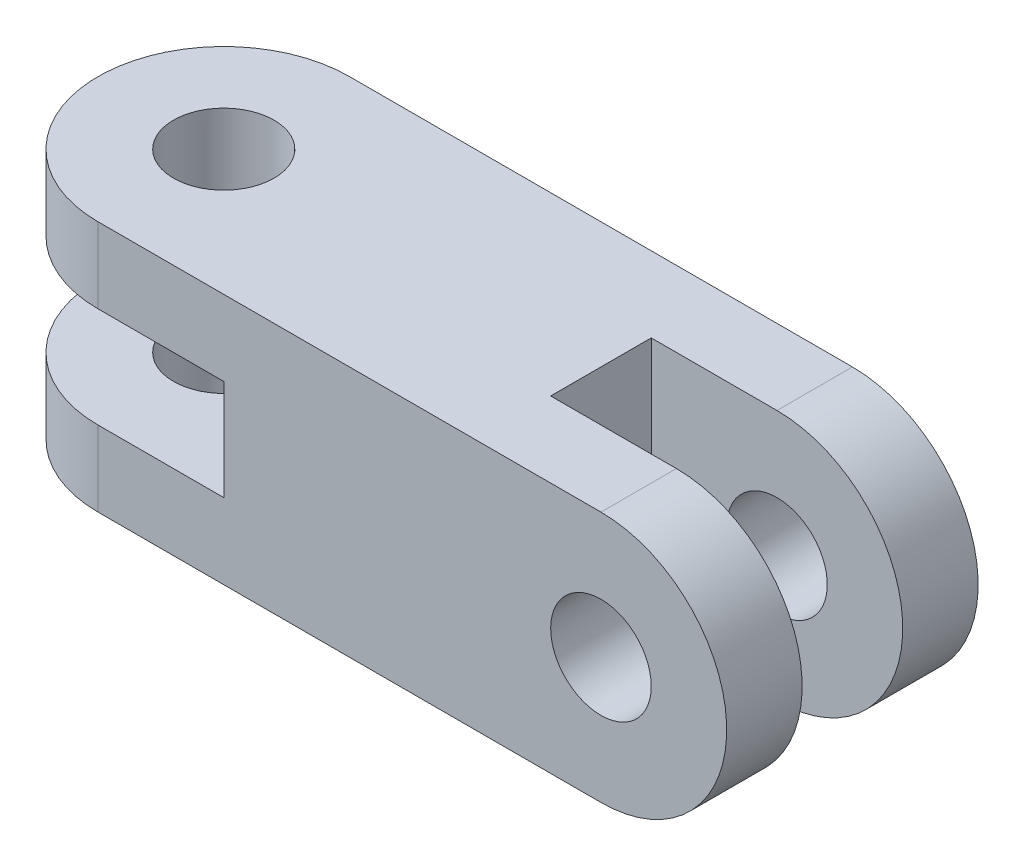
ISO-10303-21;
HEADER;
FILE_DESCRIPTION(('STEP AP214'),'2;1');
FILE_NAME('part.step','',(''),(''),'','','');
FILE_SCHEMA(('AUTOMOTIVE_DESIGN { 1 0 10303 214 1 1 1 1 }'));
ENDSEC;
DATA;
#1=APPLICATION_CONTEXT('core data for automotive mechanical design processes');
#2=APPLICATION_PROTOCOL_DEFINITION('international standard','automotive_design',2000,#1);
#3=PRODUCT_CONTEXT('',#1,'mechanical');
#4=PRODUCT('Part','Part','',(#3));
#5=PRODUCT_RELATED_PRODUCT_CATEGORY('part','',(#4));
#6=PRODUCT_DEFINITION_FORMATION('','',#4);
#7=PRODUCT_DEFINITION_CONTEXT('part definition',#1,'design');
#8=PRODUCT_DEFINITION('design','',#6,#7);
#9=PRODUCT_DEFINITION_SHAPE('','',#8);
#10=(LENGTH_UNIT() NAMED_UNIT(*) SI_UNIT(.MILLI.,.METRE.));
#11=(NAMED_UNIT(*) PLANE_ANGLE_UNIT() SI_UNIT($,.RADIAN.));
#12=(NAMED_UNIT(*) SI_UNIT($,.STERADIAN.) SOLID_ANGLE_UNIT());
#13=UNCERTAINTY_MEASURE_WITH_UNIT(LENGTH_MEASURE(1.E-05),#10,'distance_accuracy_value','');
#14=(GEOMETRIC_REPRESENTATION_CONTEXT(3) GLOBAL_UNCERTAINTY_ASSIGNED_CONTEXT((#13)) GLOBAL_UNIT_ASSIGNED_CONTEXT((#10,
#11,#12)) REPRESENTATION_CONTEXT('',''));
#15=CARTESIAN_POINT('',(0.,0.,0.));
#16=DIRECTION('',(0.,0.,1.));
#17=DIRECTION('',(1.,0.,0.));
#18=AXIS2_PLACEMENT_3D('',#15,#16,#17);
#19=CARTESIAN_POINT('',(0.,25.,50.));
#20=DIRECTION('',(0.,-1.,0.));
#21=DIRECTION('',(1.,0.,0.));
#22=AXIS2_PLACEMENT_3D('',#19,#20,#21);
#23=PLANE('',#22);
#24=CARTESIAN_POINT('',(-100.,25.,25.));
#25=DIRECTION('',(0.,-1.,0.));
#26=DIRECTION('',(1.,0.,0.));
#27=AXIS2_PLACEMENT_3D('',#24,#25,#26);
#28=CIRCLE('',#27,9.99999999999999);
#29=CARTESIAN_POINT('',(-90.,25.,25.));
#30=VERTEX_POINT('',#29);
#31=EDGE_CURVE('E319',#30,#30,#28,.T.);
#32=ORIENTED_EDGE('',*,*,#31,.T.);
#33=EDGE_LOOP('',(#32));
#34=FACE_BOUND('',#33,.T.);
#35=DIRECTION('',(0.,0.,1.));
#36=VECTOR('',#35,1.);
#37=CARTESIAN_POINT('',(-25.,25.,0.));
#38=LINE('',#37,#36);
#39=CARTESIAN_POINT('',(-25.,25.,15.));
#40=VERTEX_POINT('',#39);
#41=CARTESIAN_POINT('',(-25.,25.,35.));
#42=VERTEX_POINT('',#41);
#43=EDGE_CURVE('E334',#40,#42,#38,.T.);
#44=ORIENTED_EDGE('',*,*,#43,.F.);
#45=DIRECTION('',(1.,0.,0.));
#46=VECTOR('',#45,1.);
#47=CARTESIAN_POINT('',(0.,25.,15.));
#48=LINE('',#47,#46);
#49=CARTESIAN_POINT('',(0.,25.,15.));
#50=VERTEX_POINT('',#49);
#51=EDGE_CURVE('E329',#40,#50,#48,.T.);
#52=ORIENTED_EDGE('',*,*,#51,.T.);
#53=DIRECTION('',(0.,0.,-1.));
#54=VECTOR('',#53,1.);
#55=CARTESIAN_POINT('',(0.,25.,50.));
#56=LINE('',#55,#54);
#57=CARTESIAN_POINT('',(0.,25.,0.));
#58=VERTEX_POINT('',#57);
#59=EDGE_CURVE('E183',#50,#58,#56,.T.);
#60=ORIENTED_EDGE('',*,*,#59,.T.);
#61=DIRECTION('',(-1.,0.,0.));
#62=VECTOR('',#61,1.);
#63=CARTESIAN_POINT('',(0.,25.,0.));
#64=LINE('',#63,#62);
#65=CARTESIAN_POINT('',(-100.,25.,0.));
#66=VERTEX_POINT('',#65);
#67=EDGE_CURVE('E174',#58,#66,#64,.T.);
#68=ORIENTED_EDGE('',*,*,#67,.T.);
#69=CARTESIAN_POINT('',(-100.,25.,25.));
#70=DIRECTION('',(0.,-1.,0.));
#71=DIRECTION('',(1.,0.,0.));
#72=AXIS2_PLACEMENT_3D('',#69,#70,#71);
#73=CIRCLE('',#72,25.);
#74=CARTESIAN_POINT('',(-100.,25.,50.));
#75=VERTEX_POINT('',#74);
#76=EDGE_CURVE('E159',#75,#66,#73,.T.);
#77=ORIENTED_EDGE('',*,*,#76,.F.);
#78=DIRECTION('',(-1.,0.,0.));
#79=VECTOR('',#78,1.);
#80=CARTESIAN_POINT('',(0.,25.,50.));
#81=LINE('',#80,#79);
#82=CARTESIAN_POINT('',(0.,25.,50.));
#83=VERTEX_POINT('',#82);
#84=EDGE_CURVE('E109',#83,#75,#81,.T.);
#85=ORIENTED_EDGE('',*,*,#84,.F.);
#86=CARTESIAN_POINT('',(0.,25.,35.));
#87=VERTEX_POINT('',#86);
#88=EDGE_CURVE('E66',#83,#87,#56,.T.);
#89=ORIENTED_EDGE('',*,*,#88,.T.);
#90=DIRECTION('',(1.,0.,0.));
#91=VECTOR('',#90,1.);
#92=CARTESIAN_POINT('',(0.,25.,35.));
#93=LINE('',#92,#91);
#94=EDGE_CURVE('E331',#42,#87,#93,.T.);
#95=ORIENTED_EDGE('',*,*,#94,.F.);
#96=EDGE_LOOP('',(#44,#52,#60,#68,#77,#85,#89,#95));
#97=FACE_BOUND('',#96,.T.);
#98=ADVANCED_FACE('F57',(#34,#97),#23,.F.);
#99=CARTESIAN_POINT('',(-125.,9.99999999999999,50.));
#100=DIRECTION('',(0.,1.,0.));
#101=DIRECTION('',(0.,0.,1.));
#102=AXIS2_PLACEMENT_3D('',#99,#100,#101);
#103=PLANE('',#102);
#104=CARTESIAN_POINT('',(-100.,9.99999999999999,25.));
#105=DIRECTION('',(0.,1.,0.));
#106=DIRECTION('',(0.,0.,1.));
#107=AXIS2_PLACEMENT_3D('',#104,#105,#106);
#108=CIRCLE('',#107,9.99999999999999);
#109=CARTESIAN_POINT('',(-100.,9.99999999999999,35.));
#110=VERTEX_POINT('',#109);
#111=EDGE_CURVE('E226',#110,#110,#108,.T.);
#112=ORIENTED_EDGE('',*,*,#111,.T.);
#113=EDGE_LOOP('',(#112));
#114=FACE_BOUND('',#113,.T.);
#115=CARTESIAN_POINT('',(-100.,9.99999999999999,25.));
#116=DIRECTION('',(0.,1.,0.));
#117=DIRECTION('',(0.,0.,1.));
#118=AXIS2_PLACEMENT_3D('',#115,#116,#117);
#119=CIRCLE('',#118,25.);
#120=CARTESIAN_POINT('',(-100.,9.99999999999999,0.));
#121=VERTEX_POINT('',#120);
#122=CARTESIAN_POINT('',(-100.,9.99999999999999,50.));
#123=VERTEX_POINT('',#122);
#124=EDGE_CURVE('E233',#121,#123,#119,.T.);
#125=ORIENTED_EDGE('',*,*,#124,.F.);
#126=DIRECTION('',(1.,0.,0.));
#127=VECTOR('',#126,1.);
#128=CARTESIAN_POINT('',(-125.,9.99999999999999,0.));
#129=LINE('',#128,#127);
#130=CARTESIAN_POINT('',(-75.,9.99999999999999,0.));
#131=VERTEX_POINT('',#130);
#132=EDGE_CURVE('E176',#121,#131,#129,.T.);
#133=ORIENTED_EDGE('',*,*,#132,.T.);
#134=DIRECTION('',(0.,0.,-1.));
#135=VECTOR('',#134,1.);
#136=CARTESIAN_POINT('',(-75.,9.99999999999999,50.));
#137=LINE('',#136,#135);
#138=CARTESIAN_POINT('',(-75.,9.99999999999999,50.));
#139=VERTEX_POINT('',#138);
#140=EDGE_CURVE('E203',#139,#131,#137,.T.);
#141=ORIENTED_EDGE('',*,*,#140,.F.);
#142=DIRECTION('',(1.,0.,0.));
#143=VECTOR('',#142,1.);
#144=CARTESIAN_POINT('',(-125.,9.99999999999999,50.));
#145=LINE('',#144,#143);
#146=EDGE_CURVE('E242',#123,#139,#145,.T.);
#147=ORIENTED_EDGE('',*,*,#146,.F.);
#148=EDGE_LOOP('',(#125,#133,#141,#147));
#149=FACE_BOUND('',#148,.T.);
#150=ADVANCED_FACE('F264',(#114,#149),#103,.F.);
#151=CARTESIAN_POINT('',(-125.,-9.99999999999999,50.));
#152=DIRECTION('',(0.,-1.,0.));
#153=DIRECTION('',(0.,0.,-1.));
#154=AXIS2_PLACEMENT_3D('',#151,#152,#153);
#155=PLANE('',#154);
#156=CARTESIAN_POINT('',(-100.,-9.99999999999999,25.));
#157=DIRECTION('',(0.,-1.,0.));
#158=DIRECTION('',(0.,0.,-1.));
#159=AXIS2_PLACEMENT_3D('',#156,#157,#158);
#160=CIRCLE('',#159,9.99999999999999);
#161=CARTESIAN_POINT('',(-100.,-9.99999999999999,15.));
#162=VERTEX_POINT('',#161);
#163=EDGE_CURVE('E213',#162,#162,#160,.T.);
#164=ORIENTED_EDGE('',*,*,#163,.T.);
#165=EDGE_LOOP('',(#164));
#166=FACE_BOUND('',#165,.T.);
#167=DIRECTION('',(-1.,0.,0.));
#168=VECTOR('',#167,1.);
#169=CARTESIAN_POINT('',(-125.,-9.99999999999999,0.));
#170=LINE('',#169,#168);
#171=CARTESIAN_POINT('',(-75.,-9.99999999999999,0.));
#172=VERTEX_POINT('',#171);
#173=CARTESIAN_POINT('',(-100.,-9.99999999999999,0.));
#174=VERTEX_POINT('',#173);
#175=EDGE_CURVE('E192',#172,#174,#170,.T.);
#176=ORIENTED_EDGE('',*,*,#175,.T.);
#177=CARTESIAN_POINT('',(-100.,-9.99999999999999,25.));
#178=DIRECTION('',(0.,-1.,0.));
#179=DIRECTION('',(0.,0.,-1.));
#180=AXIS2_PLACEMENT_3D('',#177,#178,#179);
#181=CIRCLE('',#180,25.);
#182=CARTESIAN_POINT('',(-100.,-9.99999999999999,50.));
#183=VERTEX_POINT('',#182);
#184=EDGE_CURVE('E231',#183,#174,#181,.T.);
#185=ORIENTED_EDGE('',*,*,#184,.F.);
#186=DIRECTION('',(-1.,0.,0.));
#187=VECTOR('',#186,1.);
#188=CARTESIAN_POINT('',(-125.,-9.99999999999999,50.));
#189=LINE('',#188,#187);
#190=CARTESIAN_POINT('',(-75.,-9.99999999999999,50.));
#191=VERTEX_POINT('',#190);
#192=EDGE_CURVE('E246',#191,#183,#189,.T.);
#193=ORIENTED_EDGE('',*,*,#192,.F.);
#194=DIRECTION('',(0.,0.,-1.));
#195=VECTOR('',#194,1.);
#196=CARTESIAN_POINT('',(-75.,-9.99999999999999,50.));
#197=LINE('',#196,#195);
#198=EDGE_CURVE('E200',#191,#172,#197,.T.);
#199=ORIENTED_EDGE('',*,*,#198,.T.);
#200=EDGE_LOOP('',(#176,#185,#193,#199));
#201=FACE_BOUND('',#200,.T.);
#202=ADVANCED_FACE('F256',(#166,#201),#155,.F.);
#203=CARTESIAN_POINT('',(0.,-25.,50.));
#204=DIRECTION('',(0.,1.,0.));
#205=DIRECTION('',(-1.,0.,0.));
#206=AXIS2_PLACEMENT_3D('',#203,#204,#205);
#207=PLANE('',#206);
#208=CARTESIAN_POINT('',(-100.,-25.,25.));
#209=DIRECTION('',(0.,-1.,0.));
#210=DIRECTION('',(1.,0.,0.));
#211=AXIS2_PLACEMENT_3D('',#208,#209,#210);
#212=CIRCLE('',#211,9.99999999999999);
#213=CARTESIAN_POINT('',(-90.,-25.,25.));
#214=VERTEX_POINT('',#213);
#215=EDGE_CURVE('E322',#214,#214,#212,.T.);
#216=ORIENTED_EDGE('',*,*,#215,.F.);
#217=EDGE_LOOP('',(#216));
#218=FACE_BOUND('',#217,.T.);
#219=DIRECTION('',(0.,0.,-1.));
#220=VECTOR('',#219,1.);
#221=CARTESIAN_POINT('',(0.,-25.,50.));
#222=LINE('',#221,#220);
#223=CARTESIAN_POINT('',(0.,-25.,15.));
#224=VERTEX_POINT('',#223);
#225=CARTESIAN_POINT('',(0.,-25.,0.));
#226=VERTEX_POINT('',#225);
#227=EDGE_CURVE('E201',#224,#226,#222,.T.);
#228=ORIENTED_EDGE('',*,*,#227,.F.);
#229=DIRECTION('',(1.,0.,0.));
#230=VECTOR('',#229,1.);
#231=CARTESIAN_POINT('',(0.,-25.,15.));
#232=LINE('',#231,#230);
#233=CARTESIAN_POINT('',(-25.,-25.,15.));
#234=VERTEX_POINT('',#233);
#235=EDGE_CURVE('E321',#234,#224,#232,.T.);
#236=ORIENTED_EDGE('',*,*,#235,.F.);
#237=DIRECTION('',(0.,0.,1.));
#238=VECTOR('',#237,1.);
#239=CARTESIAN_POINT('',(-25.,-25.,0.));
#240=LINE('',#239,#238);
#241=CARTESIAN_POINT('',(-25.,-25.,35.));
#242=VERTEX_POINT('',#241);
#243=EDGE_CURVE('E332',#234,#242,#240,.T.);
#244=ORIENTED_EDGE('',*,*,#243,.T.);
#245=DIRECTION('',(1.,0.,0.));
#246=VECTOR('',#245,1.);
#247=CARTESIAN_POINT('',(0.,-25.,35.));
#248=LINE('',#247,#246);
#249=CARTESIAN_POINT('',(0.,-25.,35.));
#250=VERTEX_POINT('',#249);
#251=EDGE_CURVE('E324',#242,#250,#248,.T.);
#252=ORIENTED_EDGE('',*,*,#251,.T.);
#253=CARTESIAN_POINT('',(0.,-25.,50.));
#254=VERTEX_POINT('',#253);
#255=EDGE_CURVE('E197',#254,#250,#222,.T.);
#256=ORIENTED_EDGE('',*,*,#255,.F.);
#257=DIRECTION('',(1.,0.,0.));
#258=VECTOR('',#257,1.);
#259=CARTESIAN_POINT('',(0.,-25.,50.));
#260=LINE('',#259,#258);
#261=CARTESIAN_POINT('',(-100.,-25.,50.));
#262=VERTEX_POINT('',#261);
#263=EDGE_CURVE('E74',#262,#254,#260,.T.);
#264=ORIENTED_EDGE('',*,*,#263,.F.);
#265=CARTESIAN_POINT('',(-100.,-25.,25.));
#266=DIRECTION('',(0.,-1.,0.));
#267=DIRECTION('',(1.,0.,0.));
#268=AXIS2_PLACEMENT_3D('',#265,#266,#267);
#269=CIRCLE('',#268,25.);
#270=CARTESIAN_POINT('',(-100.,-25.,0.));
#271=VERTEX_POINT('',#270);
#272=EDGE_CURVE('E168',#262,#271,#269,.T.);
#273=ORIENTED_EDGE('',*,*,#272,.T.);
#274=DIRECTION('',(1.,0.,0.));
#275=VECTOR('',#274,1.);
#276=CARTESIAN_POINT('',(0.,-25.,0.));
#277=LINE('',#276,#275);
#278=EDGE_CURVE('E101',#271,#226,#277,.T.);
#279=ORIENTED_EDGE('',*,*,#278,.T.);
#280=EDGE_LOOP('',(#228,#236,#244,#252,#256,#264,#273,#279));
#281=FACE_BOUND('',#280,.T.);
#282=ADVANCED_FACE('F272',(#218,#281),#207,.F.);
#283=CARTESIAN_POINT('',(0.,0.,0.));
#284=DIRECTION('',(0.,0.,1.));
#285=DIRECTION('',(1.,0.,0.));
#286=AXIS2_PLACEMENT_3D('',#283,#284,#285);
#287=PLANE('',#286);
#288=CARTESIAN_POINT('',(0.,0.,0.));
#289=DIRECTION('',(0.,0.,1.));
#290=DIRECTION('',(1.,0.,0.));
#291=AXIS2_PLACEMENT_3D('',#288,#289,#290);
#292=CIRCLE('',#291,10.);
#293=CARTESIAN_POINT('',(10.,0.,0.));
#294=VERTEX_POINT('',#293);
#295=EDGE_CURVE('E235',#294,#294,#292,.T.);
#296=ORIENTED_EDGE('',*,*,#295,.T.);
#297=EDGE_LOOP('',(#296));
#298=FACE_BOUND('',#297,.T.);
#299=DIRECTION('',(0.,-1.,0.));
#300=VECTOR('',#299,1.);
#301=CARTESIAN_POINT('',(-100.,25.,0.));
#302=LINE('',#301,#300);
#303=EDGE_CURVE('E162',#66,#121,#302,.T.);
#304=ORIENTED_EDGE('',*,*,#303,.F.);
#305=ORIENTED_EDGE('',*,*,#67,.F.);
#306=CARTESIAN_POINT('',(0.,0.,0.));
#307=DIRECTION('',(0.,0.,1.));
#308=DIRECTION('',(1.,0.,0.));
#309=AXIS2_PLACEMENT_3D('',#306,#307,#308);
#310=CIRCLE('',#309,25.);
#311=EDGE_CURVE('E184',#226,#58,#310,.T.);
#312=ORIENTED_EDGE('',*,*,#311,.F.);
#313=ORIENTED_EDGE('',*,*,#278,.F.);
#314=DIRECTION('',(0.,-1.,0.));
#315=VECTOR('',#314,1.);
#316=CARTESIAN_POINT('',(-100.,25.,0.));
#317=LINE('',#316,#315);
#318=EDGE_CURVE('E12',#174,#271,#317,.T.);
#319=ORIENTED_EDGE('',*,*,#318,.F.);
#320=ORIENTED_EDGE('',*,*,#175,.F.);
#321=DIRECTION('',(0.,-1.,0.));
#322=VECTOR('',#321,1.);
#323=CARTESIAN_POINT('',(-75.,9.99999999999999,0.));
#324=LINE('',#323,#322);
#325=EDGE_CURVE('E93',#131,#172,#324,.T.);
#326=ORIENTED_EDGE('',*,*,#325,.F.);
#327=ORIENTED_EDGE('',*,*,#132,.F.);
#328=EDGE_LOOP('',(#304,#305,#312,#313,#319,#320,#326,#327));
#329=FACE_BOUND('',#328,.T.);
#330=ADVANCED_FACE('F172',(#298,#329),#287,.F.);
#331=CARTESIAN_POINT('',(0.,0.,50.));
#332=DIRECTION('',(0.,0.,-1.));
#333=DIRECTION('',(-1.,0.,0.));
#334=AXIS2_PLACEMENT_3D('',#331,#332,#333);
#335=CYLINDRICAL_SURFACE('',#334,25.);
#336=CARTESIAN_POINT('',(0.,0.,35.));
#337=DIRECTION('',(0.,0.,-1.));
#338=DIRECTION('',(-1.,0.,0.));
#339=AXIS2_PLACEMENT_3D('',#336,#337,#338);
#340=CIRCLE('',#339,25.);
#341=EDGE_CURVE('E207',#87,#250,#340,.T.);
#342=ORIENTED_EDGE('',*,*,#341,.F.);
#343=ORIENTED_EDGE('',*,*,#88,.F.);
#344=CARTESIAN_POINT('',(0.,0.,50.));
#345=DIRECTION('',(0.,0.,1.));
#346=DIRECTION('',(1.,0.,0.));
#347=AXIS2_PLACEMENT_3D('',#344,#345,#346);
#348=CIRCLE('',#347,25.);
#349=EDGE_CURVE('E196',#254,#83,#348,.T.);
#350=ORIENTED_EDGE('',*,*,#349,.F.);
#351=ORIENTED_EDGE('',*,*,#255,.T.);
#352=EDGE_LOOP('',(#342,#343,#350,#351));
#353=FACE_BOUND('',#352,.T.);
#354=ADVANCED_FACE('F285',(#353),#335,.T.);
#355=CARTESIAN_POINT('',(0.,0.,50.));
#356=DIRECTION('',(0.,0.,-1.));
#357=DIRECTION('',(-1.,0.,0.));
#358=AXIS2_PLACEMENT_3D('',#355,#356,#357);
#359=CYLINDRICAL_SURFACE('',#358,10.);
#360=CARTESIAN_POINT('',(0.,0.,50.));
#361=DIRECTION('',(0.,0.,1.));
#362=DIRECTION('',(1.,0.,0.));
#363=AXIS2_PLACEMENT_3D('',#360,#361,#362);
#364=CIRCLE('',#363,10.);
#365=CARTESIAN_POINT('',(10.,0.,50.));
#366=VERTEX_POINT('',#365);
#367=EDGE_CURVE('E187',#366,#366,#364,.T.);
#368=ORIENTED_EDGE('',*,*,#367,.T.);
#369=EDGE_LOOP('',(#368));
#370=FACE_BOUND('',#369,.T.);
#371=CARTESIAN_POINT('',(0.,0.,35.));
#372=DIRECTION('',(0.,0.,-1.));
#373=DIRECTION('',(-1.,0.,0.));
#374=AXIS2_PLACEMENT_3D('',#371,#372,#373);
#375=CIRCLE('',#374,10.);
#376=CARTESIAN_POINT('',(-10.,0.,35.));
#377=VERTEX_POINT('',#376);
#378=EDGE_CURVE('E177',#377,#377,#375,.T.);
#379=ORIENTED_EDGE('',*,*,#378,.T.);
#380=EDGE_LOOP('',(#379));
#381=FACE_BOUND('',#380,.T.);
#382=ADVANCED_FACE('F289',(#370,#381),#359,.F.);
#383=CARTESIAN_POINT('',(0.,0.,50.));
#384=DIRECTION('',(0.,0.,1.));
#385=DIRECTION('',(1.,0.,0.));
#386=AXIS2_PLACEMENT_3D('',#383,#384,#385);
#387=PLANE('',#386);
#388=ORIENTED_EDGE('',*,*,#367,.F.);
#389=EDGE_LOOP('',(#388));
#390=FACE_BOUND('',#389,.T.);
#391=ORIENTED_EDGE('',*,*,#84,.T.);
#392=DIRECTION('',(0.,-1.,0.));
#393=VECTOR('',#392,1.);
#394=CARTESIAN_POINT('',(-100.,25.,50.));
#395=LINE('',#394,#393);
#396=EDGE_CURVE('E165',#75,#123,#395,.T.);
#397=ORIENTED_EDGE('',*,*,#396,.T.);
#398=ORIENTED_EDGE('',*,*,#146,.T.);
#399=DIRECTION('',(0.,-1.,0.));
#400=VECTOR('',#399,1.);
#401=CARTESIAN_POINT('',(-75.,9.99999999999999,50.));
#402=LINE('',#401,#400);
#403=EDGE_CURVE('E244',#139,#191,#402,.T.);
#404=ORIENTED_EDGE('',*,*,#403,.T.);
#405=ORIENTED_EDGE('',*,*,#192,.T.);
#406=EDGE_CURVE('E167',#183,#262,#395,.T.);
#407=ORIENTED_EDGE('',*,*,#406,.T.);
#408=ORIENTED_EDGE('',*,*,#263,.T.);
#409=ORIENTED_EDGE('',*,*,#349,.T.);
#410=EDGE_LOOP('',(#391,#397,#398,#404,#405,#407,#408,#409));
#411=FACE_BOUND('',#410,.T.);
#412=ADVANCED_FACE('F261',(#390,#411),#387,.T.);
#413=ORIENTED_EDGE('',*,*,#59,.F.);
#414=CARTESIAN_POINT('',(0.,0.,15.));
#415=DIRECTION('',(0.,0.,-1.));
#416=DIRECTION('',(-1.,0.,0.));
#417=AXIS2_PLACEMENT_3D('',#414,#415,#416);
#418=CIRCLE('',#417,25.);
#419=EDGE_CURVE('E210',#50,#224,#418,.T.);
#420=ORIENTED_EDGE('',*,*,#419,.T.);
#421=ORIENTED_EDGE('',*,*,#227,.T.);
#422=ORIENTED_EDGE('',*,*,#311,.T.);
#423=EDGE_LOOP('',(#413,#420,#421,#422));
#424=FACE_BOUND('',#423,.T.);
#425=ADVANCED_FACE('F59',(#424),#335,.T.);
#426=CARTESIAN_POINT('',(-75.,9.99999999999999,50.));
#427=DIRECTION('',(1.,0.,0.));
#428=DIRECTION('',(0.,0.,-1.));
#429=AXIS2_PLACEMENT_3D('',#426,#427,#428);
#430=PLANE('',#429);
#431=ORIENTED_EDGE('',*,*,#325,.T.);
#432=ORIENTED_EDGE('',*,*,#198,.F.);
#433=ORIENTED_EDGE('',*,*,#403,.F.);
#434=ORIENTED_EDGE('',*,*,#140,.T.);
#435=EDGE_LOOP('',(#431,#432,#433,#434));
#436=FACE_BOUND('',#435,.T.);
#437=ADVANCED_FACE('F259',(#436),#430,.F.);
#438=CARTESIAN_POINT('',(0.,0.,15.));
#439=DIRECTION('',(0.,0.,-1.));
#440=DIRECTION('',(-1.,0.,0.));
#441=AXIS2_PLACEMENT_3D('',#438,#439,#440);
#442=CIRCLE('',#441,10.);
#443=CARTESIAN_POINT('',(-10.,0.,15.));
#444=VERTEX_POINT('',#443);
#445=EDGE_CURVE('E208',#444,#444,#442,.T.);
#446=ORIENTED_EDGE('',*,*,#445,.F.);
#447=EDGE_LOOP('',(#446));
#448=FACE_BOUND('',#447,.T.);
#449=ORIENTED_EDGE('',*,*,#295,.F.);
#450=EDGE_LOOP('',(#449));
#451=FACE_BOUND('',#450,.T.);
#452=ADVANCED_FACE('F278',(#448,#451),#359,.F.);
#453=CARTESIAN_POINT('',(-100.,25.,25.));
#454=DIRECTION('',(0.,-1.,0.));
#455=DIRECTION('',(1.,0.,0.));
#456=AXIS2_PLACEMENT_3D('',#453,#454,#455);
#457=CYLINDRICAL_SURFACE('',#456,25.);
#458=ORIENTED_EDGE('',*,*,#184,.T.);
#459=ORIENTED_EDGE('',*,*,#318,.T.);
#460=ORIENTED_EDGE('',*,*,#272,.F.);
#461=ORIENTED_EDGE('',*,*,#406,.F.);
#462=EDGE_LOOP('',(#458,#459,#460,#461));
#463=FACE_BOUND('',#462,.T.);
#464=ADVANCED_FACE('F293',(#463),#457,.T.);
#465=ORIENTED_EDGE('',*,*,#124,.T.);
#466=ORIENTED_EDGE('',*,*,#396,.F.);
#467=ORIENTED_EDGE('',*,*,#76,.T.);
#468=ORIENTED_EDGE('',*,*,#303,.T.);
#469=EDGE_LOOP('',(#465,#466,#467,#468));
#470=FACE_BOUND('',#469,.T.);
#471=ADVANCED_FACE('F161',(#470),#457,.T.);
#472=CARTESIAN_POINT('',(0.,25.,15.));
#473=DIRECTION('',(0.,0.,-1.));
#474=DIRECTION('',(-1.,0.,0.));
#475=AXIS2_PLACEMENT_3D('',#472,#473,#474);
#476=PLANE('',#475);
#477=ORIENTED_EDGE('',*,*,#445,.T.);
#478=EDGE_LOOP('',(#477));
#479=FACE_BOUND('',#478,.T.);
#480=ORIENTED_EDGE('',*,*,#51,.F.);
#481=DIRECTION('',(0.,-1.,0.));
#482=VECTOR('',#481,1.);
#483=CARTESIAN_POINT('',(-25.,25.,15.));
#484=LINE('',#483,#482);
#485=EDGE_CURVE('E178',#40,#234,#484,.T.);
#486=ORIENTED_EDGE('',*,*,#485,.T.);
#487=ORIENTED_EDGE('',*,*,#235,.T.);
#488=ORIENTED_EDGE('',*,*,#419,.F.);
#489=EDGE_LOOP('',(#480,#486,#487,#488));
#490=FACE_BOUND('',#489,.T.);
#491=ADVANCED_FACE('F297',(#479,#490),#476,.F.);
#492=CARTESIAN_POINT('',(0.,25.,35.));
#493=DIRECTION('',(0.,0.,-1.));
#494=DIRECTION('',(-1.,0.,0.));
#495=AXIS2_PLACEMENT_3D('',#492,#493,#494);
#496=PLANE('',#495);
#497=ORIENTED_EDGE('',*,*,#378,.F.);
#498=EDGE_LOOP('',(#497));
#499=FACE_BOUND('',#498,.T.);
#500=ORIENTED_EDGE('',*,*,#341,.T.);
#501=ORIENTED_EDGE('',*,*,#251,.F.);
#502=DIRECTION('',(0.,-1.,0.));
#503=VECTOR('',#502,1.);
#504=CARTESIAN_POINT('',(-25.,25.,35.));
#505=LINE('',#504,#503);
#506=EDGE_CURVE('E221',#42,#242,#505,.T.);
#507=ORIENTED_EDGE('',*,*,#506,.F.);
#508=ORIENTED_EDGE('',*,*,#94,.T.);
#509=EDGE_LOOP('',(#500,#501,#507,#508));
#510=FACE_BOUND('',#509,.T.);
#511=ADVANCED_FACE('F300',(#499,#510),#496,.T.);
#512=CARTESIAN_POINT('',(-25.,25.,0.));
#513=DIRECTION('',(1.,0.,0.));
#514=DIRECTION('',(0.,1.,0.));
#515=AXIS2_PLACEMENT_3D('',#512,#513,#514);
#516=PLANE('',#515);
#517=ORIENTED_EDGE('',*,*,#243,.F.);
#518=ORIENTED_EDGE('',*,*,#485,.F.);
#519=ORIENTED_EDGE('',*,*,#43,.T.);
#520=ORIENTED_EDGE('',*,*,#506,.T.);
#521=EDGE_LOOP('',(#517,#518,#519,#520));
#522=FACE_BOUND('',#521,.T.);
#523=ADVANCED_FACE('F303',(#522),#516,.T.);
#524=CARTESIAN_POINT('',(-100.,25.,25.));
#525=DIRECTION('',(0.,-1.,0.));
#526=DIRECTION('',(1.,0.,0.));
#527=AXIS2_PLACEMENT_3D('',#524,#525,#526);
#528=CYLINDRICAL_SURFACE('',#527,9.99999999999999);
#529=ORIENTED_EDGE('',*,*,#215,.T.);
#530=EDGE_LOOP('',(#529));
#531=FACE_BOUND('',#530,.T.);
#532=ORIENTED_EDGE('',*,*,#163,.F.);
#533=EDGE_LOOP('',(#532));
#534=FACE_BOUND('',#533,.T.);
#535=ADVANCED_FACE('F307',(#531,#534),#528,.F.);
#536=ORIENTED_EDGE('',*,*,#31,.F.);
#537=EDGE_LOOP('',(#536));
#538=FACE_BOUND('',#537,.T.);
#539=ORIENTED_EDGE('',*,*,#111,.F.);
#540=EDGE_LOOP('',(#539));
#541=FACE_BOUND('',#540,.T.);
#542=ADVANCED_FACE('F309',(#538,#541),#528,.F.);
#543=CLOSED_SHELL('',(#98,#150,#202,#282,#330,#354,#382,#412,#425,#437,#452,#464,#471,#491,#511,
#523,#535,#542));
#544=MANIFOLD_SOLID_BREP('B2',#543);
#545=ADVANCED_BREP_SHAPE_REPRESENTATION('',(#18,#544),#14);
#546=SHAPE_DEFINITION_REPRESENTATION(#9,#545);
ENDSEC;
END-ISO-10303-21;
